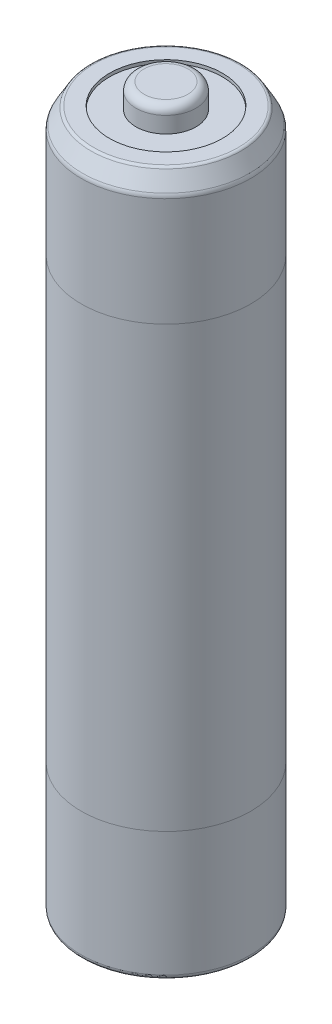
ISO-10303-21;
HEADER;
FILE_DESCRIPTION(('STEP AP214'),'2;1');
FILE_NAME('part.step','',(''),(''),'','','');
FILE_SCHEMA(('AUTOMOTIVE_DESIGN { 1 0 10303 214 1 1 1 1 }'));
ENDSEC;
DATA;
#1=APPLICATION_CONTEXT('core data for automotive mechanical design processes');
#2=APPLICATION_PROTOCOL_DEFINITION('international standard','automotive_design',2000,#1);
#3=PRODUCT_CONTEXT('',#1,'mechanical');
#4=PRODUCT('Part','Part','',(#3));
#5=PRODUCT_RELATED_PRODUCT_CATEGORY('part','',(#4));
#6=PRODUCT_DEFINITION_FORMATION('','',#4);
#7=PRODUCT_DEFINITION_CONTEXT('part definition',#1,'design');
#8=PRODUCT_DEFINITION('design','',#6,#7);
#9=PRODUCT_DEFINITION_SHAPE('','',#8);
#10=(LENGTH_UNIT() NAMED_UNIT(*) SI_UNIT(.MILLI.,.METRE.));
#11=(NAMED_UNIT(*) PLANE_ANGLE_UNIT() SI_UNIT($,.RADIAN.));
#12=(NAMED_UNIT(*) SI_UNIT($,.STERADIAN.) SOLID_ANGLE_UNIT());
#13=UNCERTAINTY_MEASURE_WITH_UNIT(LENGTH_MEASURE(1.E-05),#10,'distance_accuracy_value','');
#14=(GEOMETRIC_REPRESENTATION_CONTEXT(3) GLOBAL_UNCERTAINTY_ASSIGNED_CONTEXT((#13)) GLOBAL_UNIT_ASSIGNED_CONTEXT((#10,
#11,#12)) REPRESENTATION_CONTEXT('',''));
#15=CARTESIAN_POINT('',(0.,0.,0.));
#16=DIRECTION('',(0.,0.,1.));
#17=DIRECTION('',(1.,0.,0.));
#18=AXIS2_PLACEMENT_3D('',#15,#16,#17);
#19=CARTESIAN_POINT('',(0.,0.,0.));
#20=DIRECTION('',(0.,-1.,0.));
#21=DIRECTION('',(0.,0.,-1.));
#22=AXIS2_PLACEMENT_3D('',#19,#20,#21);
#23=CYLINDRICAL_SURFACE('',#22,5.25);
#24=CARTESIAN_POINT('',(0.,8.,0.));
#25=DIRECTION('',(0.,1.,0.));
#26=DIRECTION('',(0.,0.,1.));
#27=AXIS2_PLACEMENT_3D('',#24,#25,#26);
#28=CIRCLE('',#27,5.25);
#29=CARTESIAN_POINT('',(-5.25,8.,0.));
#30=VERTEX_POINT('',#29);
#31=CARTESIAN_POINT('',(5.25,8.,0.));
#32=VERTEX_POINT('',#31);
#33=EDGE_CURVE('E66',#30,#32,#28,.T.);
#34=ORIENTED_EDGE('',*,*,#33,.T.);
#35=EDGE_CURVE('E64',#32,#30,#28,.T.);
#36=ORIENTED_EDGE('',*,*,#35,.T.);
#37=EDGE_LOOP('',(#34,#36));
#38=FACE_BOUND('',#37,.T.);
#39=CARTESIAN_POINT('',(0.,35.2,0.));
#40=DIRECTION('',(0.,1.,0.));
#41=DIRECTION('',(0.,0.,1.));
#42=AXIS2_PLACEMENT_3D('',#39,#40,#41);
#43=CIRCLE('',#42,5.25);
#44=CARTESIAN_POINT('',(5.25,35.2,0.));
#45=VERTEX_POINT('',#44);
#46=CARTESIAN_POINT('',(-5.25,35.2,0.));
#47=VERTEX_POINT('',#46);
#48=EDGE_CURVE('E11',#45,#47,#43,.T.);
#49=ORIENTED_EDGE('',*,*,#48,.F.);
#50=EDGE_CURVE('E44',#47,#45,#43,.T.);
#51=ORIENTED_EDGE('',*,*,#50,.F.);
#52=EDGE_LOOP('',(#49,#51));
#53=FACE_BOUND('',#52,.T.);
#54=ADVANCED_FACE('F40',(#38,#53),#23,.T.);
#55=CARTESIAN_POINT('',(0.,0.299999999999999,0.));
#56=DIRECTION('',(0.,-1.,0.));
#57=DIRECTION('',(0.,0.,-1.));
#58=AXIS2_PLACEMENT_3D('',#55,#56,#57);
#59=CIRCLE('',#58,5.25);
#60=CARTESIAN_POINT('',(0.,0.299999999999999,-5.25));
#61=VERTEX_POINT('',#60);
#62=EDGE_CURVE('E76',#61,#61,#59,.T.);
#63=ORIENTED_EDGE('',*,*,#62,.F.);
#64=EDGE_LOOP('',(#63));
#65=FACE_BOUND('',#64,.T.);
#66=ORIENTED_EDGE('',*,*,#35,.F.);
#67=ORIENTED_EDGE('',*,*,#33,.F.);
#68=EDGE_LOOP('',(#66,#67));
#69=FACE_BOUND('',#68,.T.);
#70=ADVANCED_FACE('F69',(#65,#69),#23,.T.);
#71=CARTESIAN_POINT('',(0.,0.,0.));
#72=DIRECTION('',(0.,1.,0.));
#73=DIRECTION('',(0.,0.,1.));
#74=AXIS2_PLACEMENT_3D('',#71,#72,#73);
#75=PLANE('',#74);
#76=CARTESIAN_POINT('',(0.,0.,0.));
#77=DIRECTION('',(0.,-1.,0.));
#78=DIRECTION('',(0.,0.,-1.));
#79=AXIS2_PLACEMENT_3D('',#76,#77,#78);
#80=CIRCLE('',#79,4.95);
#81=CARTESIAN_POINT('',(0.,0.,-4.95));
#82=VERTEX_POINT('',#81);
#83=EDGE_CURVE('E71',#82,#82,#80,.T.);
#84=ORIENTED_EDGE('',*,*,#83,.T.);
#85=EDGE_LOOP('',(#84));
#86=FACE_BOUND('',#85,.T.);
#87=ADVANCED_FACE('F42',(#86),#75,.F.);
#88=CARTESIAN_POINT('',(0.,0.299999999999999,0.));
#89=DIRECTION('',(0.,-1.,0.));
#90=DIRECTION('',(0.,0.,-1.));
#91=AXIS2_PLACEMENT_3D('',#88,#89,#90);
#92=TOROIDAL_SURFACE('',#91,4.95,0.3);
#93=ORIENTED_EDGE('',*,*,#83,.F.);
#94=EDGE_LOOP('',(#93));
#95=FACE_BOUND('',#94,.T.);
#96=ORIENTED_EDGE('',*,*,#62,.T.);
#97=EDGE_LOOP('',(#96));
#98=FACE_BOUND('',#97,.T.);
#99=ADVANCED_FACE('F139',(#95,#98),#92,.T.);
#100=ORIENTED_EDGE('',*,*,#50,.T.);
#101=ORIENTED_EDGE('',*,*,#48,.T.);
#102=EDGE_LOOP('',(#100,#101));
#103=FACE_BOUND('',#102,.T.);
#104=CARTESIAN_POINT('',(0.,41.9267949192431,0.));
#105=DIRECTION('',(0.,-1.,0.));
#106=DIRECTION('',(0.,0.,-1.));
#107=AXIS2_PLACEMENT_3D('',#104,#105,#106);
#108=CIRCLE('',#107,5.25);
#109=CARTESIAN_POINT('',(0.,41.9267949192431,-5.25));
#110=VERTEX_POINT('',#109);
#111=EDGE_CURVE('E82',#110,#110,#108,.T.);
#112=ORIENTED_EDGE('',*,*,#111,.T.);
#113=EDGE_LOOP('',(#112));
#114=FACE_BOUND('',#113,.T.);
#115=ADVANCED_FACE('F131',(#103,#114),#23,.T.);
#116=CARTESIAN_POINT('',(0.,41.9267949192431,0.));
#117=DIRECTION('',(0.,-1.,0.));
#118=DIRECTION('',(0.,0.,-1.));
#119=AXIS2_PLACEMENT_3D('',#116,#117,#118);
#120=TOROIDAL_SURFACE('',#119,4.75,0.500000000000001);
#121=ORIENTED_EDGE('',*,*,#111,.F.);
#122=EDGE_LOOP('',(#121));
#123=FACE_BOUND('',#122,.T.);
#124=CARTESIAN_POINT('',(0.,42.1767949192431,0.));
#125=DIRECTION('',(0.,-1.,0.));
#126=DIRECTION('',(0.,0.,-1.));
#127=AXIS2_PLACEMENT_3D('',#124,#125,#126);
#128=CIRCLE('',#127,5.18301270189222);
#129=CARTESIAN_POINT('',(0.,42.1767949192431,-5.18301270189222));
#130=VERTEX_POINT('',#129);
#131=EDGE_CURVE('E86',#130,#130,#128,.T.);
#132=ORIENTED_EDGE('',*,*,#131,.T.);
#133=EDGE_LOOP('',(#132));
#134=FACE_BOUND('',#133,.T.);
#135=ADVANCED_FACE('F138',(#123,#134),#120,.T.);
#136=CARTESIAN_POINT('',(0.,43.1,0.));
#137=DIRECTION('',(0.,-1.,0.));
#138=DIRECTION('',(0.,0.,-1.));
#139=AXIS2_PLACEMENT_3D('',#136,#137,#138);
#140=CONICAL_SURFACE('',#139,4.65,0.523598775598291);
#141=ORIENTED_EDGE('',*,*,#131,.F.);
#142=EDGE_LOOP('',(#141));
#143=FACE_BOUND('',#142,.T.);
#144=CARTESIAN_POINT('',(0.,43.1,0.));
#145=DIRECTION('',(0.,-1.,0.));
#146=DIRECTION('',(0.,0.,-1.));
#147=AXIS2_PLACEMENT_3D('',#144,#145,#146);
#148=CIRCLE('',#147,4.65);
#149=CARTESIAN_POINT('',(0.,43.1,-4.65));
#150=VERTEX_POINT('',#149);
#151=EDGE_CURVE('E89',#150,#150,#148,.T.);
#152=ORIENTED_EDGE('',*,*,#151,.T.);
#153=EDGE_LOOP('',(#152));
#154=FACE_BOUND('',#153,.T.);
#155=ADVANCED_FACE('F144',(#143,#154),#140,.T.);
#156=CARTESIAN_POINT('',(0.,43.,0.));
#157=DIRECTION('',(0.,-1.,0.));
#158=DIRECTION('',(0.,0.,-1.));
#159=AXIS2_PLACEMENT_3D('',#156,#157,#158);
#160=TOROIDAL_SURFACE('',#159,4.47679491924311,0.2);
#161=ORIENTED_EDGE('',*,*,#151,.F.);
#162=EDGE_LOOP('',(#161));
#163=FACE_BOUND('',#162,.T.);
#164=CARTESIAN_POINT('',(0.,43.2,0.));
#165=DIRECTION('',(0.,-1.,0.));
#166=DIRECTION('',(0.,0.,-1.));
#167=AXIS2_PLACEMENT_3D('',#164,#165,#166);
#168=CIRCLE('',#167,4.47679491924311);
#169=CARTESIAN_POINT('',(0.,43.2,-4.47679491924311));
#170=VERTEX_POINT('',#169);
#171=EDGE_CURVE('E93',#170,#170,#168,.T.);
#172=ORIENTED_EDGE('',*,*,#171,.T.);
#173=EDGE_LOOP('',(#172));
#174=FACE_BOUND('',#173,.T.);
#175=ADVANCED_FACE('F154',(#163,#174),#160,.T.);
#176=CARTESIAN_POINT('',(-3.5,43.2,0.));
#177=DIRECTION('',(0.,-1.,0.));
#178=DIRECTION('',(0.,0.,-1.));
#179=AXIS2_PLACEMENT_3D('',#176,#177,#178);
#180=PLANE('',#179);
#181=ORIENTED_EDGE('',*,*,#171,.F.);
#182=EDGE_LOOP('',(#181));
#183=FACE_BOUND('',#182,.T.);
#184=CARTESIAN_POINT('',(0.,43.2,0.));
#185=DIRECTION('',(0.,-1.,0.));
#186=DIRECTION('',(0.,0.,-1.));
#187=AXIS2_PLACEMENT_3D('',#184,#185,#186);
#188=CIRCLE('',#187,3.5);
#189=CARTESIAN_POINT('',(0.,43.2,-3.5));
#190=VERTEX_POINT('',#189);
#191=EDGE_CURVE('E97',#190,#190,#188,.T.);
#192=ORIENTED_EDGE('',*,*,#191,.T.);
#193=EDGE_LOOP('',(#192));
#194=FACE_BOUND('',#193,.T.);
#195=ADVANCED_FACE('F160',(#183,#194),#180,.F.);
#196=CARTESIAN_POINT('',(0.,0.,0.));
#197=DIRECTION('',(0.,-1.,0.));
#198=DIRECTION('',(0.,0.,-1.));
#199=AXIS2_PLACEMENT_3D('',#196,#197,#198);
#200=CYLINDRICAL_SURFACE('',#199,3.5);
#201=ORIENTED_EDGE('',*,*,#191,.F.);
#202=EDGE_LOOP('',(#201));
#203=FACE_BOUND('',#202,.T.);
#204=CARTESIAN_POINT('',(0.,43.,0.));
#205=DIRECTION('',(0.,-1.,0.));
#206=DIRECTION('',(0.,0.,-1.));
#207=AXIS2_PLACEMENT_3D('',#204,#205,#206);
#208=CIRCLE('',#207,3.5);
#209=CARTESIAN_POINT('',(0.,43.,-3.5));
#210=VERTEX_POINT('',#209);
#211=EDGE_CURVE('E101',#210,#210,#208,.T.);
#212=ORIENTED_EDGE('',*,*,#211,.T.);
#213=EDGE_LOOP('',(#212));
#214=FACE_BOUND('',#213,.T.);
#215=ADVANCED_FACE('F166',(#203,#214),#200,.F.);
#216=CARTESIAN_POINT('',(-3.5,43.,0.));
#217=DIRECTION('',(0.,-1.,0.));
#218=DIRECTION('',(0.,0.,-1.));
#219=AXIS2_PLACEMENT_3D('',#216,#217,#218);
#220=PLANE('',#219);
#221=ORIENTED_EDGE('',*,*,#211,.F.);
#222=EDGE_LOOP('',(#221));
#223=FACE_BOUND('',#222,.T.);
#224=CARTESIAN_POINT('',(0.,43.,0.));
#225=DIRECTION('',(0.,-1.,0.));
#226=DIRECTION('',(0.,0.,-1.));
#227=AXIS2_PLACEMENT_3D('',#224,#225,#226);
#228=CIRCLE('',#227,1.86);
#229=CARTESIAN_POINT('',(0.,43.,-1.86));
#230=VERTEX_POINT('',#229);
#231=EDGE_CURVE('E105',#230,#230,#228,.T.);
#232=ORIENTED_EDGE('',*,*,#231,.T.);
#233=EDGE_LOOP('',(#232));
#234=FACE_BOUND('',#233,.T.);
#235=ADVANCED_FACE('F172',(#223,#234),#220,.F.);
#236=CARTESIAN_POINT('',(0.,0.,0.));
#237=DIRECTION('',(0.,-1.,0.));
#238=DIRECTION('',(0.,0.,-1.));
#239=AXIS2_PLACEMENT_3D('',#236,#237,#238);
#240=CYLINDRICAL_SURFACE('',#239,1.86);
#241=ORIENTED_EDGE('',*,*,#231,.F.);
#242=EDGE_LOOP('',(#241));
#243=FACE_BOUND('',#242,.T.);
#244=CARTESIAN_POINT('',(0.,44.,0.));
#245=DIRECTION('',(0.,-1.,0.));
#246=DIRECTION('',(0.,0.,-1.));
#247=AXIS2_PLACEMENT_3D('',#244,#245,#246);
#248=CIRCLE('',#247,1.86);
#249=CARTESIAN_POINT('',(0.,44.,-1.86));
#250=VERTEX_POINT('',#249);
#251=EDGE_CURVE('E109',#250,#250,#248,.T.);
#252=ORIENTED_EDGE('',*,*,#251,.T.);
#253=EDGE_LOOP('',(#252));
#254=FACE_BOUND('',#253,.T.);
#255=ADVANCED_FACE('F126',(#243,#254),#240,.T.);
#256=CARTESIAN_POINT('',(0.,44.,0.));
#257=DIRECTION('',(0.,-1.,0.));
#258=DIRECTION('',(0.,0.,-1.));
#259=AXIS2_PLACEMENT_3D('',#256,#257,#258);
#260=TOROIDAL_SURFACE('',#259,1.36,0.5);
#261=ORIENTED_EDGE('',*,*,#251,.F.);
#262=EDGE_LOOP('',(#261));
#263=FACE_BOUND('',#262,.T.);
#264=CARTESIAN_POINT('',(0.,44.5,0.));
#265=DIRECTION('',(0.,-1.,0.));
#266=DIRECTION('',(0.,0.,-1.));
#267=AXIS2_PLACEMENT_3D('',#264,#265,#266);
#268=CIRCLE('',#267,1.36);
#269=CARTESIAN_POINT('',(0.,44.5,-1.36));
#270=VERTEX_POINT('',#269);
#271=EDGE_CURVE('E113',#270,#270,#268,.T.);
#272=ORIENTED_EDGE('',*,*,#271,.T.);
#273=EDGE_LOOP('',(#272));
#274=FACE_BOUND('',#273,.T.);
#275=ADVANCED_FACE('F118',(#263,#274),#260,.T.);
#276=CARTESIAN_POINT('',(-1.36,44.5,0.));
#277=DIRECTION('',(0.,-1.,0.));
#278=DIRECTION('',(0.,0.,-1.));
#279=AXIS2_PLACEMENT_3D('',#276,#277,#278);
#280=PLANE('',#279);
#281=ORIENTED_EDGE('',*,*,#271,.F.);
#282=EDGE_LOOP('',(#281));
#283=FACE_BOUND('',#282,.T.);
#284=ADVANCED_FACE('F120',(#283),#280,.F.);
#285=CLOSED_SHELL('',(#54,#70,#87,#99,#115,#135,#155,#175,#195,#215,#235,#255,#275,#284));
#286=MANIFOLD_SOLID_BREP('B2',#285);
#287=ADVANCED_BREP_SHAPE_REPRESENTATION('',(#18,#286),#14);
#288=SHAPE_DEFINITION_REPRESENTATION(#9,#287);
ENDSEC;
END-ISO-10303-21;
